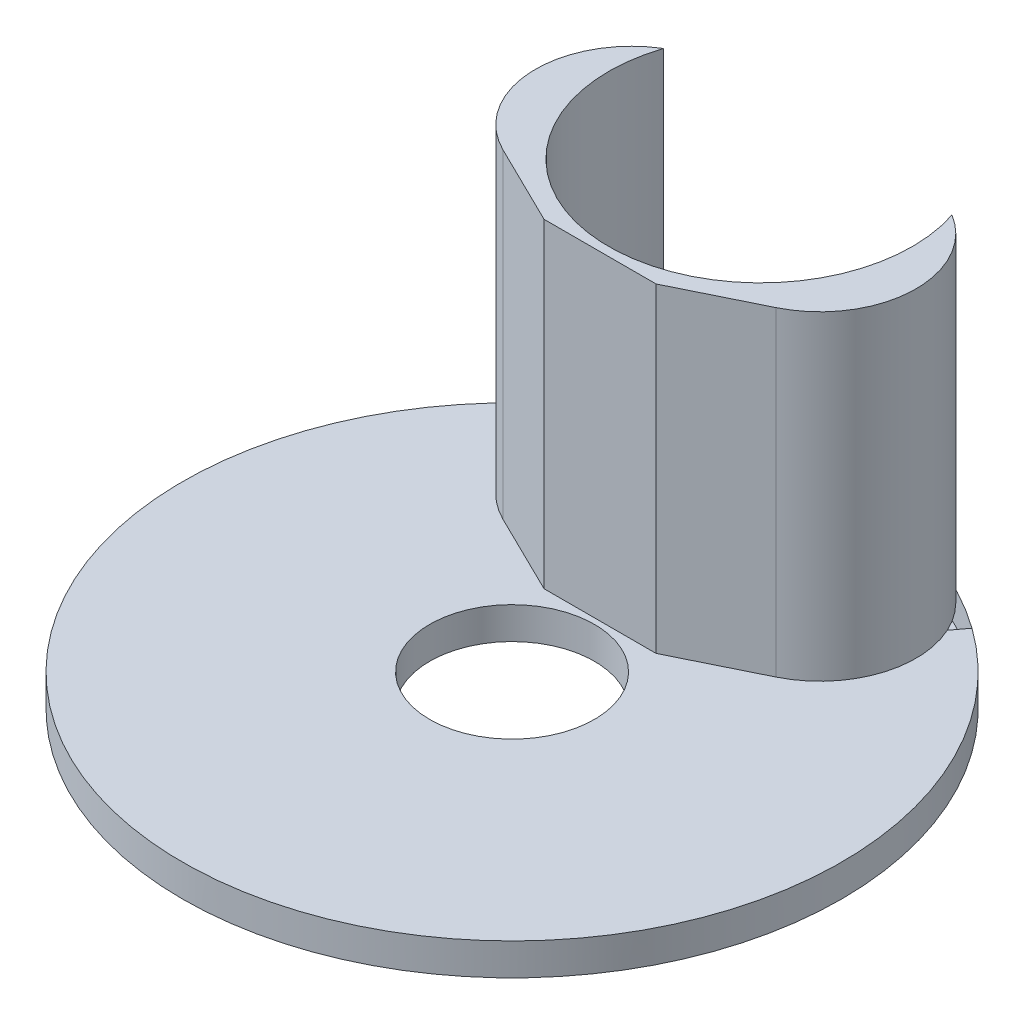
ISO-10303-21;
HEADER;
FILE_DESCRIPTION(('STEP AP214'),'2;1');
FILE_NAME('part.step','',(''),(''),'','','');
FILE_SCHEMA(('AUTOMOTIVE_DESIGN { 1 0 10303 214 1 1 1 1 }'));
ENDSEC;
DATA;
#1=APPLICATION_CONTEXT('core data for automotive mechanical design processes');
#2=APPLICATION_PROTOCOL_DEFINITION('international standard','automotive_design',2000,#1);
#3=PRODUCT_CONTEXT('',#1,'mechanical');
#4=PRODUCT('Part','Part','',(#3));
#5=PRODUCT_RELATED_PRODUCT_CATEGORY('part','',(#4));
#6=PRODUCT_DEFINITION_FORMATION('','',#4);
#7=PRODUCT_DEFINITION_CONTEXT('part definition',#1,'design');
#8=PRODUCT_DEFINITION('design','',#6,#7);
#9=PRODUCT_DEFINITION_SHAPE('','',#8);
#10=(LENGTH_UNIT() NAMED_UNIT(*) SI_UNIT(.MILLI.,.METRE.));
#11=(NAMED_UNIT(*) PLANE_ANGLE_UNIT() SI_UNIT($,.RADIAN.));
#12=(NAMED_UNIT(*) SI_UNIT($,.STERADIAN.) SOLID_ANGLE_UNIT());
#13=UNCERTAINTY_MEASURE_WITH_UNIT(LENGTH_MEASURE(1.E-05),#10,'distance_accuracy_value','');
#14=(GEOMETRIC_REPRESENTATION_CONTEXT(3) GLOBAL_UNCERTAINTY_ASSIGNED_CONTEXT((#13)) GLOBAL_UNIT_ASSIGNED_CONTEXT((#10,
#11,#12)) REPRESENTATION_CONTEXT('',''));
#15=CARTESIAN_POINT('',(0.,0.,0.));
#16=DIRECTION('',(0.,0.,1.));
#17=DIRECTION('',(1.,0.,0.));
#18=AXIS2_PLACEMENT_3D('',#15,#16,#17);
#19=CARTESIAN_POINT('',(0.,2.,0.));
#20=DIRECTION('',(0.,1.,0.));
#21=DIRECTION('',(0.,0.,1.));
#22=AXIS2_PLACEMENT_3D('',#19,#20,#21);
#23=PLANE('',#22);
#24=CARTESIAN_POINT('',(0.,2.,-13.));
#25=DIRECTION('',(0.,1.,0.));
#26=DIRECTION('',(0.,0.,1.));
#27=AXIS2_PLACEMENT_3D('',#24,#25,#26);
#28=CIRCLE('',#27,6.5);
#29=CARTESIAN_POINT('',(0.,2.,-6.5));
#30=VERTEX_POINT('',#29);
#31=EDGE_CURVE('E110',#30,#30,#28,.T.);
#32=ORIENTED_EDGE('',*,*,#31,.F.);
#33=EDGE_LOOP('',(#32));
#34=FACE_BOUND('',#33,.T.);
#35=CARTESIAN_POINT('',(0.,2.,-15.5296842366197));
#36=DIRECTION('',(0.,1.,0.));
#37=DIRECTION('',(0.,0.,1.));
#38=AXIS2_PLACEMENT_3D('',#35,#36,#37);
#39=CIRCLE('',#38,9.48692515810502);
#40=CARTESIAN_POINT('',(-9.01622934624997,2.,-18.4808462672962));
#41=VERTEX_POINT('',#40);
#42=CARTESIAN_POINT('',(9.01622934624997,2.,-18.4808462672962));
#43=VERTEX_POINT('',#42);
#44=EDGE_CURVE('E137',#41,#43,#39,.T.);
#45=ORIENTED_EDGE('',*,*,#44,.T.);
#46=CARTESIAN_POINT('',(5.89271105563148,2.,-13.3579922299288));
#47=DIRECTION('',(0.,1.,0.));
#48=DIRECTION('',(0.,0.,1.));
#49=AXIS2_PLACEMENT_3D('',#46,#47,#48);
#50=CIRCLE('',#49,6.);
#51=CARTESIAN_POINT('',(8.31437313328825,2.,-18.8475780778448));
#52=VERTEX_POINT('',#51);
#53=EDGE_CURVE('E195',#43,#52,#50,.T.);
#54=ORIENTED_EDGE('',*,*,#53,.T.);
#55=CARTESIAN_POINT('',(0.,2.,0.));
#56=DIRECTION('',(0.,1.,0.));
#57=DIRECTION('',(0.,0.,1.));
#58=AXIS2_PLACEMENT_3D('',#55,#56,#57);
#59=CIRCLE('',#58,20.6);
#60=CARTESIAN_POINT('',(-8.31437313328825,2.,-18.8475780778448));
#61=VERTEX_POINT('',#60);
#62=EDGE_CURVE('E163',#52,#61,#59,.T.);
#63=ORIENTED_EDGE('',*,*,#62,.T.);
#64=CARTESIAN_POINT('',(-5.89271105563148,2.,-13.3579922299288));
#65=DIRECTION('',(0.,1.,0.));
#66=DIRECTION('',(0.,0.,1.));
#67=AXIS2_PLACEMENT_3D('',#64,#65,#66);
#68=CIRCLE('',#67,6.);
#69=EDGE_CURVE('E191',#61,#41,#68,.T.);
#70=ORIENTED_EDGE('',*,*,#69,.T.);
#71=EDGE_LOOP('',(#45,#54,#63,#70));
#72=FACE_BOUND('',#71,.T.);
#73=ADVANCED_FACE('F41',(#34,#72),#23,.T.);
#74=CARTESIAN_POINT('',(0.,2.,0.));
#75=DIRECTION('',(0.,-1.,0.));
#76=DIRECTION('',(0.,0.,-1.));
#77=AXIS2_PLACEMENT_3D('',#74,#75,#76);
#78=CYLINDRICAL_SURFACE('',#77,20.6);
#79=EDGE_CURVE('E167',#61,#52,#59,.T.);
#80=ORIENTED_EDGE('',*,*,#79,.F.);
#81=ORIENTED_EDGE('',*,*,#62,.F.);
#82=EDGE_LOOP('',(#80,#81));
#83=FACE_BOUND('',#82,.T.);
#84=CARTESIAN_POINT('',(0.,0.,0.));
#85=DIRECTION('',(0.,1.,0.));
#86=DIRECTION('',(0.,0.,1.));
#87=AXIS2_PLACEMENT_3D('',#84,#85,#86);
#88=CIRCLE('',#87,20.6);
#89=CARTESIAN_POINT('',(0.,0.,20.6));
#90=VERTEX_POINT('',#89);
#91=EDGE_CURVE('E168',#90,#90,#88,.T.);
#92=ORIENTED_EDGE('',*,*,#91,.T.);
#93=EDGE_LOOP('',(#92));
#94=FACE_BOUND('',#93,.T.);
#95=ADVANCED_FACE('F216',(#83,#94),#78,.T.);
#96=DIRECTION('',(0.897709903987118,0.,-0.440587026912322));
#97=VECTOR('',#96,1.);
#98=CARTESIAN_POINT('',(-1.49594710795883,2.,-3.04803921274508));
#99=LINE('',#98,#97);
#100=CARTESIAN_POINT('',(3.5,2.,-5.5));
#101=VERTEX_POINT('',#100);
#102=CARTESIAN_POINT('',(8.53623321710542,2.,-7.9717328060061));
#103=VERTEX_POINT('',#102);
#104=EDGE_CURVE('E132',#101,#103,#99,.T.);
#105=ORIENTED_EDGE('',*,*,#104,.F.);
#106=DIRECTION('',(1.,0.,0.));
#107=VECTOR('',#106,1.);
#108=CARTESIAN_POINT('',(0.,2.,-5.5));
#109=LINE('',#108,#107);
#110=CARTESIAN_POINT('',(-3.5,2.,-5.5));
#111=VERTEX_POINT('',#110);
#112=EDGE_CURVE('E143',#111,#101,#109,.T.);
#113=ORIENTED_EDGE('',*,*,#112,.F.);
#114=DIRECTION('',(-0.897709903987118,0.,-0.440587026912322));
#115=VECTOR('',#114,1.);
#116=CARTESIAN_POINT('',(1.49594710795883,2.,-3.04803921274508));
#117=LINE('',#116,#115);
#118=CARTESIAN_POINT('',(-8.53623321710542,2.,-7.9717328060061));
#119=VERTEX_POINT('',#118);
#120=EDGE_CURVE('E106',#111,#119,#117,.T.);
#121=ORIENTED_EDGE('',*,*,#120,.T.);
#122=CARTESIAN_POINT('',(-5.89271105563148,2.,-13.3579922299288));
#123=DIRECTION('',(0.,1.,0.));
#124=DIRECTION('',(0.,0.,1.));
#125=AXIS2_PLACEMENT_3D('',#122,#123,#124);
#126=CIRCLE('',#125,6.);
#127=EDGE_CURVE('E11',#119,#41,#126,.F.);
#128=ORIENTED_EDGE('',*,*,#127,.T.);
#129=ORIENTED_EDGE('',*,*,#69,.F.);
#130=ORIENTED_EDGE('',*,*,#79,.T.);
#131=ORIENTED_EDGE('',*,*,#53,.F.);
#132=CARTESIAN_POINT('',(5.89271105563148,2.,-13.3579922299288));
#133=DIRECTION('',(0.,1.,0.));
#134=DIRECTION('',(0.,0.,1.));
#135=AXIS2_PLACEMENT_3D('',#132,#133,#134);
#136=CIRCLE('',#135,6.);
#137=EDGE_CURVE('E50',#43,#103,#136,.F.);
#138=ORIENTED_EDGE('',*,*,#137,.T.);
#139=EDGE_LOOP('',(#105,#113,#121,#128,#129,#130,#131,#138));
#140=FACE_BOUND('',#139,.T.);
#141=CARTESIAN_POINT('',(0.,2.,0.));
#142=DIRECTION('',(0.,1.,0.));
#143=DIRECTION('',(0.,0.,1.));
#144=AXIS2_PLACEMENT_3D('',#141,#142,#143);
#145=CIRCLE('',#144,5.15);
#146=CARTESIAN_POINT('',(0.,2.,5.15));
#147=VERTEX_POINT('',#146);
#148=EDGE_CURVE('E155',#147,#147,#145,.T.);
#149=ORIENTED_EDGE('',*,*,#148,.F.);
#150=EDGE_LOOP('',(#149));
#151=FACE_BOUND('',#150,.T.);
#152=ADVANCED_FACE('F204',(#140,#151),#23,.T.);
#153=CARTESIAN_POINT('',(0.,0.,0.));
#154=DIRECTION('',(0.,1.,0.));
#155=DIRECTION('',(0.,0.,1.));
#156=AXIS2_PLACEMENT_3D('',#153,#154,#155);
#157=PLANE('',#156);
#158=CARTESIAN_POINT('',(0.,0.,-13.));
#159=DIRECTION('',(0.,1.,0.));
#160=DIRECTION('',(0.,0.,1.));
#161=AXIS2_PLACEMENT_3D('',#158,#159,#160);
#162=CIRCLE('',#161,6.5);
#163=CARTESIAN_POINT('',(0.,0.,-6.5));
#164=VERTEX_POINT('',#163);
#165=EDGE_CURVE('E151',#164,#164,#162,.T.);
#166=ORIENTED_EDGE('',*,*,#165,.T.);
#167=EDGE_LOOP('',(#166));
#168=FACE_BOUND('',#167,.T.);
#169=CARTESIAN_POINT('',(0.,0.,0.));
#170=DIRECTION('',(0.,1.,0.));
#171=DIRECTION('',(0.,0.,1.));
#172=AXIS2_PLACEMENT_3D('',#169,#170,#171);
#173=CIRCLE('',#172,5.15);
#174=CARTESIAN_POINT('',(0.,0.,5.15));
#175=VERTEX_POINT('',#174);
#176=EDGE_CURVE('E162',#175,#175,#173,.T.);
#177=ORIENTED_EDGE('',*,*,#176,.T.);
#178=EDGE_LOOP('',(#177));
#179=FACE_BOUND('',#178,.T.);
#180=ORIENTED_EDGE('',*,*,#91,.F.);
#181=EDGE_LOOP('',(#180));
#182=FACE_BOUND('',#181,.T.);
#183=ADVANCED_FACE('F223',(#168,#179,#182),#157,.F.);
#184=CARTESIAN_POINT('',(0.,-1.,0.));
#185=DIRECTION('',(0.,1.,0.));
#186=DIRECTION('',(0.,0.,1.));
#187=AXIS2_PLACEMENT_3D('',#184,#185,#186);
#188=CYLINDRICAL_SURFACE('',#187,5.15);
#189=ORIENTED_EDGE('',*,*,#148,.T.);
#190=EDGE_LOOP('',(#189));
#191=FACE_BOUND('',#190,.T.);
#192=ORIENTED_EDGE('',*,*,#176,.F.);
#193=EDGE_LOOP('',(#192));
#194=FACE_BOUND('',#193,.T.);
#195=ADVANCED_FACE('F225',(#191,#194),#188,.F.);
#196=CARTESIAN_POINT('',(0.,0.,-13.));
#197=DIRECTION('',(0.,1.,0.));
#198=DIRECTION('',(0.,0.,1.));
#199=AXIS2_PLACEMENT_3D('',#196,#197,#198);
#200=CYLINDRICAL_SURFACE('',#199,6.5);
#201=ORIENTED_EDGE('',*,*,#165,.F.);
#202=EDGE_LOOP('',(#201));
#203=FACE_BOUND('',#202,.T.);
#204=ORIENTED_EDGE('',*,*,#31,.T.);
#205=EDGE_LOOP('',(#204));
#206=FACE_BOUND('',#205,.T.);
#207=ADVANCED_FACE('F232',(#203,#206),#200,.F.);
#208=CARTESIAN_POINT('',(0.,22.,-15.5296842366197));
#209=DIRECTION('',(0.,-1.,0.));
#210=DIRECTION('',(0.,0.,-1.));
#211=AXIS2_PLACEMENT_3D('',#208,#209,#210);
#212=CYLINDRICAL_SURFACE('',#211,9.48692515810502);
#213=CARTESIAN_POINT('',(0.,22.,-15.5296842366197));
#214=DIRECTION('',(0.,1.,0.));
#215=DIRECTION('',(0.,0.,1.));
#216=AXIS2_PLACEMENT_3D('',#213,#214,#215);
#217=CIRCLE('',#216,9.48692515810502);
#218=CARTESIAN_POINT('',(-9.01622934624997,22.,-18.4808462672962));
#219=VERTEX_POINT('',#218);
#220=CARTESIAN_POINT('',(9.01622934624997,22.,-18.4808462672962));
#221=VERTEX_POINT('',#220);
#222=EDGE_CURVE('E128',#219,#221,#217,.T.);
#223=ORIENTED_EDGE('',*,*,#222,.T.);
#224=DIRECTION('',(0.,-1.,0.));
#225=VECTOR('',#224,1.);
#226=CARTESIAN_POINT('',(9.01622934624997,22.,-18.4808462672962));
#227=LINE('',#226,#225);
#228=EDGE_CURVE('E187',#221,#43,#227,.T.);
#229=ORIENTED_EDGE('',*,*,#228,.T.);
#230=ORIENTED_EDGE('',*,*,#44,.F.);
#231=DIRECTION('',(0.,-1.,0.));
#232=VECTOR('',#231,1.);
#233=CARTESIAN_POINT('',(-9.01622934624997,2.,-18.4808462672962));
#234=LINE('',#233,#232);
#235=EDGE_CURVE('E184',#41,#219,#234,.F.);
#236=ORIENTED_EDGE('',*,*,#235,.T.);
#237=EDGE_LOOP('',(#223,#229,#230,#236));
#238=FACE_BOUND('',#237,.T.);
#239=ADVANCED_FACE('F210',(#238),#212,.F.);
#240=CARTESIAN_POINT('',(1.49594710795883,22.,-3.04803921274508));
#241=DIRECTION('',(-0.440587026912321,0.,0.897709903987118));
#242=DIRECTION('',(0.897709903987118,0.,0.440587026912321));
#243=AXIS2_PLACEMENT_3D('',#240,#241,#242);
#244=PLANE('',#243);
#245=DIRECTION('',(-0.897709903987118,0.,-0.440587026912322));
#246=VECTOR('',#245,1.);
#247=CARTESIAN_POINT('',(1.49594710795883,22.,-3.04803921274508));
#248=LINE('',#247,#246);
#249=CARTESIAN_POINT('',(-3.5,22.,-5.5));
#250=VERTEX_POINT('',#249);
#251=CARTESIAN_POINT('',(-8.53623321710542,22.,-7.9717328060061));
#252=VERTEX_POINT('',#251);
#253=EDGE_CURVE('E104',#250,#252,#248,.T.);
#254=ORIENTED_EDGE('',*,*,#253,.T.);
#255=DIRECTION('',(0.,1.,0.));
#256=VECTOR('',#255,1.);
#257=CARTESIAN_POINT('',(-8.53623321710541,2.,-7.9717328060061));
#258=LINE('',#257,#256);
#259=EDGE_CURVE('E199',#252,#119,#258,.F.);
#260=ORIENTED_EDGE('',*,*,#259,.T.);
#261=ORIENTED_EDGE('',*,*,#120,.F.);
#262=DIRECTION('',(0.,-1.,0.));
#263=VECTOR('',#262,1.);
#264=CARTESIAN_POINT('',(-3.5,22.,-5.5));
#265=LINE('',#264,#263);
#266=EDGE_CURVE('E100',#250,#111,#265,.T.);
#267=ORIENTED_EDGE('',*,*,#266,.F.);
#268=EDGE_LOOP('',(#254,#260,#261,#267));
#269=FACE_BOUND('',#268,.T.);
#270=ADVANCED_FACE('F102',(#269),#244,.T.);
#271=CARTESIAN_POINT('',(0.,22.,-5.5));
#272=DIRECTION('',(0.,0.,-1.));
#273=DIRECTION('',(-1.,0.,0.));
#274=AXIS2_PLACEMENT_3D('',#271,#272,#273);
#275=PLANE('',#274);
#276=ORIENTED_EDGE('',*,*,#112,.T.);
#277=DIRECTION('',(0.,-1.,0.));
#278=VECTOR('',#277,1.);
#279=CARTESIAN_POINT('',(3.5,22.,-5.5));
#280=LINE('',#279,#278);
#281=CARTESIAN_POINT('',(3.5,22.,-5.5));
#282=VERTEX_POINT('',#281);
#283=EDGE_CURVE('E111',#282,#101,#280,.T.);
#284=ORIENTED_EDGE('',*,*,#283,.F.);
#285=DIRECTION('',(1.,0.,0.));
#286=VECTOR('',#285,1.);
#287=CARTESIAN_POINT('',(0.,22.,-5.5));
#288=LINE('',#287,#286);
#289=EDGE_CURVE('E114',#250,#282,#288,.T.);
#290=ORIENTED_EDGE('',*,*,#289,.F.);
#291=ORIENTED_EDGE('',*,*,#266,.T.);
#292=EDGE_LOOP('',(#276,#284,#290,#291));
#293=FACE_BOUND('',#292,.T.);
#294=ADVANCED_FACE('F115',(#293),#275,.F.);
#295=CARTESIAN_POINT('',(-1.49594710795883,22.,-3.04803921274508));
#296=DIRECTION('',(-0.440587026912321,0.,-0.897709903987118));
#297=DIRECTION('',(-0.897709903987118,0.,0.440587026912321));
#298=AXIS2_PLACEMENT_3D('',#295,#296,#297);
#299=PLANE('',#298);
#300=ORIENTED_EDGE('',*,*,#104,.T.);
#301=DIRECTION('',(0.,-1.,0.));
#302=VECTOR('',#301,1.);
#303=CARTESIAN_POINT('',(8.53623321710541,22.,-7.9717328060061));
#304=LINE('',#303,#302);
#305=CARTESIAN_POINT('',(8.53623321710542,22.,-7.9717328060061));
#306=VERTEX_POINT('',#305);
#307=EDGE_CURVE('E175',#103,#306,#304,.F.);
#308=ORIENTED_EDGE('',*,*,#307,.T.);
#309=DIRECTION('',(0.897709903987118,0.,-0.440587026912322));
#310=VECTOR('',#309,1.);
#311=CARTESIAN_POINT('',(-1.49594710795883,22.,-3.04803921274508));
#312=LINE('',#311,#310);
#313=EDGE_CURVE('E121',#282,#306,#312,.T.);
#314=ORIENTED_EDGE('',*,*,#313,.F.);
#315=ORIENTED_EDGE('',*,*,#283,.T.);
#316=EDGE_LOOP('',(#300,#308,#314,#315));
#317=FACE_BOUND('',#316,.T.);
#318=ADVANCED_FACE('F207',(#317),#299,.F.);
#319=CARTESIAN_POINT('',(0.,22.,0.));
#320=DIRECTION('',(0.,1.,0.));
#321=DIRECTION('',(0.,0.,1.));
#322=AXIS2_PLACEMENT_3D('',#319,#320,#321);
#323=PLANE('',#322);
#324=ORIENTED_EDGE('',*,*,#313,.T.);
#325=CARTESIAN_POINT('',(5.89271105563148,22.,-13.3579922299288));
#326=DIRECTION('',(0.,1.,0.));
#327=DIRECTION('',(0.,0.,1.));
#328=AXIS2_PLACEMENT_3D('',#325,#326,#327);
#329=CIRCLE('',#328,6.);
#330=EDGE_CURVE('E181',#306,#221,#329,.T.);
#331=ORIENTED_EDGE('',*,*,#330,.T.);
#332=ORIENTED_EDGE('',*,*,#222,.F.);
#333=CARTESIAN_POINT('',(-5.89271105563148,22.,-13.3579922299288));
#334=DIRECTION('',(0.,1.,0.));
#335=DIRECTION('',(0.,0.,1.));
#336=AXIS2_PLACEMENT_3D('',#333,#334,#335);
#337=CIRCLE('',#336,6.);
#338=EDGE_CURVE('E126',#219,#252,#337,.T.);
#339=ORIENTED_EDGE('',*,*,#338,.T.);
#340=ORIENTED_EDGE('',*,*,#253,.F.);
#341=ORIENTED_EDGE('',*,*,#289,.T.);
#342=EDGE_LOOP('',(#324,#331,#332,#339,#340,#341));
#343=FACE_BOUND('',#342,.T.);
#344=ADVANCED_FACE('F123',(#343),#323,.T.);
#345=CARTESIAN_POINT('',(5.89271105563148,2.,-13.3579922299288));
#346=DIRECTION('',(0.,-1.,0.));
#347=DIRECTION('',(0.,0.,-1.));
#348=AXIS2_PLACEMENT_3D('',#345,#346,#347);
#349=CYLINDRICAL_SURFACE('',#348,6.);
#350=ORIENTED_EDGE('',*,*,#330,.F.);
#351=ORIENTED_EDGE('',*,*,#307,.F.);
#352=ORIENTED_EDGE('',*,*,#137,.F.);
#353=ORIENTED_EDGE('',*,*,#228,.F.);
#354=EDGE_LOOP('',(#350,#351,#352,#353));
#355=FACE_BOUND('',#354,.T.);
#356=ADVANCED_FACE('F208',(#355),#349,.T.);
#357=CARTESIAN_POINT('',(-5.89271105563148,2.,-13.3579922299288));
#358=DIRECTION('',(0.,-1.,0.));
#359=DIRECTION('',(0.,0.,-1.));
#360=AXIS2_PLACEMENT_3D('',#357,#358,#359);
#361=CYLINDRICAL_SURFACE('',#360,6.);
#362=ORIENTED_EDGE('',*,*,#235,.F.);
#363=ORIENTED_EDGE('',*,*,#127,.F.);
#364=ORIENTED_EDGE('',*,*,#259,.F.);
#365=ORIENTED_EDGE('',*,*,#338,.F.);
#366=EDGE_LOOP('',(#362,#363,#364,#365));
#367=FACE_BOUND('',#366,.T.);
#368=ADVANCED_FACE('F43',(#367),#361,.T.);
#369=CLOSED_SHELL('',(#73,#95,#152,#183,#195,#207,#239,#270,#294,#318,#344,#356,#368));
#370=MANIFOLD_SOLID_BREP('B2',#369);
#371=ADVANCED_BREP_SHAPE_REPRESENTATION('',(#18,#370),#14);
#372=SHAPE_DEFINITION_REPRESENTATION(#9,#371);
ENDSEC;
END-ISO-10303-21;
